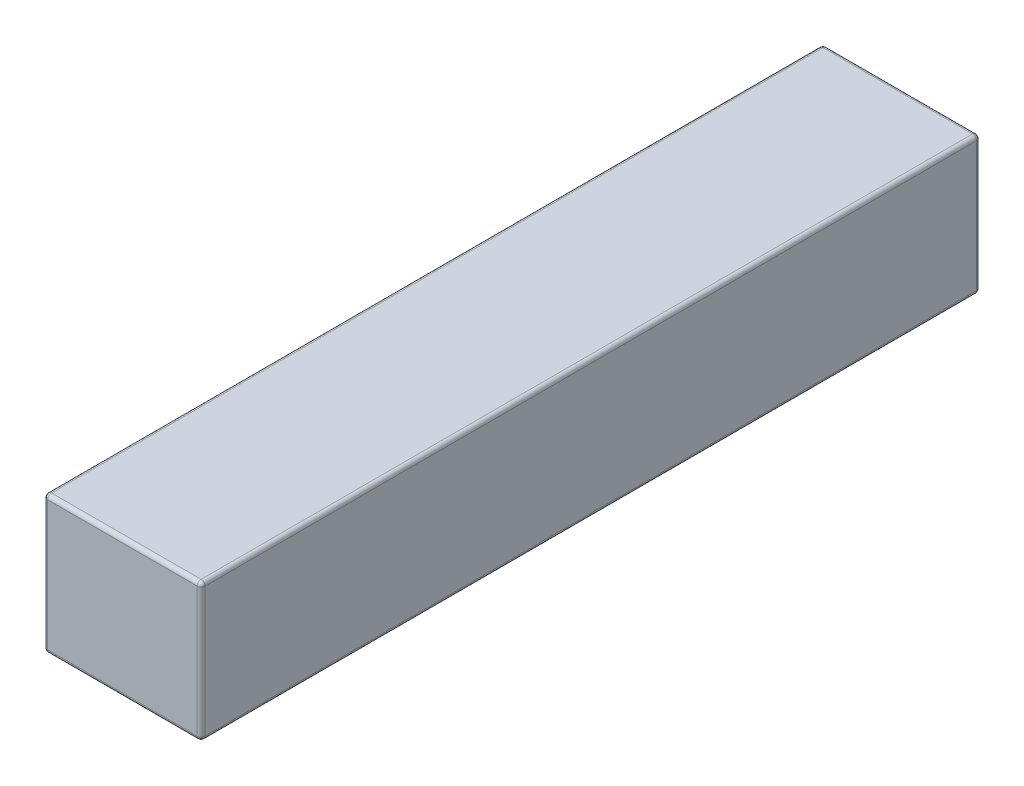
ISO-10303-21;
HEADER;
FILE_DESCRIPTION(('STEP AP214'),'2;1');
FILE_NAME('part.step','',(''),(''),'','','');
FILE_SCHEMA(('AUTOMOTIVE_DESIGN { 1 0 10303 214 1 1 1 1 }'));
ENDSEC;
DATA;
#1=APPLICATION_CONTEXT('core data for automotive mechanical design processes');
#2=APPLICATION_PROTOCOL_DEFINITION('international standard','automotive_design',2000,#1);
#3=PRODUCT_CONTEXT('',#1,'mechanical');
#4=PRODUCT('Part','Part','',(#3));
#5=PRODUCT_RELATED_PRODUCT_CATEGORY('part','',(#4));
#6=PRODUCT_DEFINITION_FORMATION('','',#4);
#7=PRODUCT_DEFINITION_CONTEXT('part definition',#1,'design');
#8=PRODUCT_DEFINITION('design','',#6,#7);
#9=PRODUCT_DEFINITION_SHAPE('','',#8);
#10=(LENGTH_UNIT() NAMED_UNIT(*) SI_UNIT(.MILLI.,.METRE.));
#11=(NAMED_UNIT(*) PLANE_ANGLE_UNIT() SI_UNIT($,.RADIAN.));
#12=(NAMED_UNIT(*) SI_UNIT($,.STERADIAN.) SOLID_ANGLE_UNIT());
#13=UNCERTAINTY_MEASURE_WITH_UNIT(LENGTH_MEASURE(1.E-05),#10,'distance_accuracy_value','');
#14=(GEOMETRIC_REPRESENTATION_CONTEXT(3) GLOBAL_UNCERTAINTY_ASSIGNED_CONTEXT((#13)) GLOBAL_UNIT_ASSIGNED_CONTEXT((#10,
#11,#12)) REPRESENTATION_CONTEXT('',''));
#15=CARTESIAN_POINT('',(0.,0.,0.));
#16=DIRECTION('',(0.,0.,1.));
#17=DIRECTION('',(1.,0.,0.));
#18=AXIS2_PLACEMENT_3D('',#15,#16,#17);
#19=CARTESIAN_POINT('',(-200.,-175.,1980.));
#20=DIRECTION('',(1.,0.,0.));
#21=DIRECTION('',(0.,0.,-1.));
#22=AXIS2_PLACEMENT_3D('',#19,#20,#21);
#23=PLANE('',#22);
#24=DIRECTION('',(0.,0.,-1.));
#25=VECTOR('',#24,1.);
#26=CARTESIAN_POINT('',(-200.,-165.,1980.));
#27=LINE('',#26,#25);
#28=CARTESIAN_POINT('',(-200.,-165.,10.));
#29=VERTEX_POINT('',#28);
#30=CARTESIAN_POINT('',(-200.,-165.,1970.));
#31=VERTEX_POINT('',#30);
#32=EDGE_CURVE('E128',#29,#31,#27,.F.);
#33=ORIENTED_EDGE('',*,*,#32,.T.);
#34=DIRECTION('',(0.,-1.,0.));
#35=VECTOR('',#34,1.);
#36=CARTESIAN_POINT('',(-200.,175.,1970.));
#37=LINE('',#36,#35);
#38=CARTESIAN_POINT('',(-200.,165.,1970.));
#39=VERTEX_POINT('',#38);
#40=EDGE_CURVE('E165',#31,#39,#37,.F.);
#41=ORIENTED_EDGE('',*,*,#40,.T.);
#42=DIRECTION('',(0.,0.,-1.));
#43=VECTOR('',#42,1.);
#44=CARTESIAN_POINT('',(-200.,165.,1980.));
#45=LINE('',#44,#43);
#46=CARTESIAN_POINT('',(-200.,165.,10.));
#47=VERTEX_POINT('',#46);
#48=EDGE_CURVE('E162',#39,#47,#45,.T.);
#49=ORIENTED_EDGE('',*,*,#48,.T.);
#50=DIRECTION('',(0.,-1.,0.));
#51=VECTOR('',#50,1.);
#52=CARTESIAN_POINT('',(-200.,-175.,10.));
#53=LINE('',#52,#51);
#54=EDGE_CURVE('E157',#47,#29,#53,.T.);
#55=ORIENTED_EDGE('',*,*,#54,.T.);
#56=EDGE_LOOP('',(#33,#41,#49,#55));
#57=FACE_BOUND('',#56,.T.);
#58=ADVANCED_FACE('F33',(#57),#23,.F.);
#59=CARTESIAN_POINT('',(200.,-175.,1980.));
#60=DIRECTION('',(0.,1.,0.));
#61=DIRECTION('',(-1.,0.,0.));
#62=AXIS2_PLACEMENT_3D('',#59,#60,#61);
#63=PLANE('',#62);
#64=DIRECTION('',(0.,0.,-1.));
#65=VECTOR('',#64,1.);
#66=CARTESIAN_POINT('',(190.,-175.,1980.));
#67=LINE('',#66,#65);
#68=CARTESIAN_POINT('',(190.,-175.,10.));
#69=VERTEX_POINT('',#68);
#70=CARTESIAN_POINT('',(190.,-175.,1970.));
#71=VERTEX_POINT('',#70);
#72=EDGE_CURVE('E150',#69,#71,#67,.F.);
#73=ORIENTED_EDGE('',*,*,#72,.T.);
#74=DIRECTION('',(1.,0.,0.));
#75=VECTOR('',#74,1.);
#76=CARTESIAN_POINT('',(-200.,-175.,1970.));
#77=LINE('',#76,#75);
#78=CARTESIAN_POINT('',(-190.,-175.,1970.));
#79=VERTEX_POINT('',#78);
#80=EDGE_CURVE('E154',#71,#79,#77,.F.);
#81=ORIENTED_EDGE('',*,*,#80,.T.);
#82=DIRECTION('',(0.,0.,-1.));
#83=VECTOR('',#82,1.);
#84=CARTESIAN_POINT('',(-190.,-175.,1980.));
#85=LINE('',#84,#83);
#86=CARTESIAN_POINT('',(-190.,-175.,10.));
#87=VERTEX_POINT('',#86);
#88=EDGE_CURVE('E126',#79,#87,#85,.T.);
#89=ORIENTED_EDGE('',*,*,#88,.T.);
#90=DIRECTION('',(1.,0.,0.));
#91=VECTOR('',#90,1.);
#92=CARTESIAN_POINT('',(200.,-175.,10.));
#93=LINE('',#92,#91);
#94=EDGE_CURVE('E144',#87,#69,#93,.T.);
#95=ORIENTED_EDGE('',*,*,#94,.T.);
#96=EDGE_LOOP('',(#73,#81,#89,#95));
#97=FACE_BOUND('',#96,.T.);
#98=ADVANCED_FACE('F152',(#97),#63,.F.);
#99=CARTESIAN_POINT('',(200.,-175.,1980.));
#100=DIRECTION('',(-1.,0.,0.));
#101=DIRECTION('',(0.,0.,1.));
#102=AXIS2_PLACEMENT_3D('',#99,#100,#101);
#103=PLANE('',#102);
#104=DIRECTION('',(0.,0.,-1.));
#105=VECTOR('',#104,1.);
#106=CARTESIAN_POINT('',(200.,165.,1980.));
#107=LINE('',#106,#105);
#108=CARTESIAN_POINT('',(200.,165.,10.));
#109=VERTEX_POINT('',#108);
#110=CARTESIAN_POINT('',(200.,165.,1970.));
#111=VERTEX_POINT('',#110);
#112=EDGE_CURVE('E169',#109,#111,#107,.F.);
#113=ORIENTED_EDGE('',*,*,#112,.T.);
#114=DIRECTION('',(0.,1.,0.));
#115=VECTOR('',#114,1.);
#116=CARTESIAN_POINT('',(200.,-175.,1970.));
#117=LINE('',#116,#115);
#118=CARTESIAN_POINT('',(200.,-165.,1970.));
#119=VERTEX_POINT('',#118);
#120=EDGE_CURVE('E174',#111,#119,#117,.F.);
#121=ORIENTED_EDGE('',*,*,#120,.T.);
#122=DIRECTION('',(0.,0.,-1.));
#123=VECTOR('',#122,1.);
#124=CARTESIAN_POINT('',(200.,-165.,1980.));
#125=LINE('',#124,#123);
#126=CARTESIAN_POINT('',(200.,-165.,10.));
#127=VERTEX_POINT('',#126);
#128=EDGE_CURVE('E171',#119,#127,#125,.T.);
#129=ORIENTED_EDGE('',*,*,#128,.T.);
#130=DIRECTION('',(0.,1.,0.));
#131=VECTOR('',#130,1.);
#132=CARTESIAN_POINT('',(200.,-175.,10.));
#133=LINE('',#132,#131);
#134=EDGE_CURVE('E167',#127,#109,#133,.T.);
#135=ORIENTED_EDGE('',*,*,#134,.T.);
#136=EDGE_LOOP('',(#113,#121,#129,#135));
#137=FACE_BOUND('',#136,.T.);
#138=ADVANCED_FACE('F279',(#137),#103,.F.);
#139=CARTESIAN_POINT('',(200.,175.,1980.));
#140=DIRECTION('',(0.,-1.,0.));
#141=DIRECTION('',(1.,0.,0.));
#142=AXIS2_PLACEMENT_3D('',#139,#140,#141);
#143=PLANE('',#142);
#144=DIRECTION('',(0.,0.,-1.));
#145=VECTOR('',#144,1.);
#146=CARTESIAN_POINT('',(-190.,175.,1980.));
#147=LINE('',#146,#145);
#148=CARTESIAN_POINT('',(-190.,175.,10.));
#149=VERTEX_POINT('',#148);
#150=CARTESIAN_POINT('',(-190.,175.,1970.));
#151=VERTEX_POINT('',#150);
#152=EDGE_CURVE('E178',#149,#151,#147,.F.);
#153=ORIENTED_EDGE('',*,*,#152,.T.);
#154=DIRECTION('',(-1.,0.,0.));
#155=VECTOR('',#154,1.);
#156=CARTESIAN_POINT('',(200.,175.,1970.));
#157=LINE('',#156,#155);
#158=CARTESIAN_POINT('',(190.,175.,1970.));
#159=VERTEX_POINT('',#158);
#160=EDGE_CURVE('E183',#151,#159,#157,.F.);
#161=ORIENTED_EDGE('',*,*,#160,.T.);
#162=DIRECTION('',(0.,0.,-1.));
#163=VECTOR('',#162,1.);
#164=CARTESIAN_POINT('',(190.,175.,1980.));
#165=LINE('',#164,#163);
#166=CARTESIAN_POINT('',(190.,175.,10.));
#167=VERTEX_POINT('',#166);
#168=EDGE_CURVE('E180',#159,#167,#165,.T.);
#169=ORIENTED_EDGE('',*,*,#168,.T.);
#170=DIRECTION('',(-1.,0.,0.));
#171=VECTOR('',#170,1.);
#172=CARTESIAN_POINT('',(200.,175.,10.));
#173=LINE('',#172,#171);
#174=EDGE_CURVE('E176',#167,#149,#173,.T.);
#175=ORIENTED_EDGE('',*,*,#174,.T.);
#176=EDGE_LOOP('',(#153,#161,#169,#175));
#177=FACE_BOUND('',#176,.T.);
#178=ADVANCED_FACE('F289',(#177),#143,.F.);
#179=CARTESIAN_POINT('',(0.,0.,1980.));
#180=DIRECTION('',(0.,0.,1.));
#181=DIRECTION('',(1.,0.,0.));
#182=AXIS2_PLACEMENT_3D('',#179,#180,#181);
#183=PLANE('',#182);
#184=DIRECTION('',(0.,1.,0.));
#185=VECTOR('',#184,1.);
#186=CARTESIAN_POINT('',(190.,175.,1980.));
#187=LINE('',#186,#185);
#188=CARTESIAN_POINT('',(190.,-165.,1980.));
#189=VERTEX_POINT('',#188);
#190=CARTESIAN_POINT('',(190.,165.,1980.));
#191=VERTEX_POINT('',#190);
#192=EDGE_CURVE('E189',#189,#191,#187,.T.);
#193=ORIENTED_EDGE('',*,*,#192,.T.);
#194=DIRECTION('',(-1.,0.,0.));
#195=VECTOR('',#194,1.);
#196=CARTESIAN_POINT('',(-200.,165.,1980.));
#197=LINE('',#196,#195);
#198=CARTESIAN_POINT('',(-190.,165.,1980.));
#199=VERTEX_POINT('',#198);
#200=EDGE_CURVE('E191',#191,#199,#197,.T.);
#201=ORIENTED_EDGE('',*,*,#200,.T.);
#202=DIRECTION('',(0.,-1.,0.));
#203=VECTOR('',#202,1.);
#204=CARTESIAN_POINT('',(-190.,-175.,1980.));
#205=LINE('',#204,#203);
#206=CARTESIAN_POINT('',(-190.,-165.,1980.));
#207=VERTEX_POINT('',#206);
#208=EDGE_CURVE('E185',#199,#207,#205,.T.);
#209=ORIENTED_EDGE('',*,*,#208,.T.);
#210=DIRECTION('',(1.,0.,0.));
#211=VECTOR('',#210,1.);
#212=CARTESIAN_POINT('',(200.,-165.,1980.));
#213=LINE('',#212,#211);
#214=EDGE_CURVE('E187',#207,#189,#213,.T.);
#215=ORIENTED_EDGE('',*,*,#214,.T.);
#216=EDGE_LOOP('',(#193,#201,#209,#215));
#217=FACE_BOUND('',#216,.T.);
#218=ADVANCED_FACE('F271',(#217),#183,.T.);
#219=CARTESIAN_POINT('',(0.,0.,0.));
#220=DIRECTION('',(0.,0.,1.));
#221=DIRECTION('',(1.,0.,0.));
#222=AXIS2_PLACEMENT_3D('',#219,#220,#221);
#223=PLANE('',#222);
#224=DIRECTION('',(0.,-1.,0.));
#225=VECTOR('',#224,1.);
#226=CARTESIAN_POINT('',(-190.,0.,0.));
#227=LINE('',#226,#225);
#228=CARTESIAN_POINT('',(-190.,-165.,0.));
#229=VERTEX_POINT('',#228);
#230=CARTESIAN_POINT('',(-190.,165.,0.));
#231=VERTEX_POINT('',#230);
#232=EDGE_CURVE('E194',#229,#231,#227,.F.);
#233=ORIENTED_EDGE('',*,*,#232,.T.);
#234=DIRECTION('',(-1.,0.,0.));
#235=VECTOR('',#234,1.);
#236=CARTESIAN_POINT('',(0.,165.,0.));
#237=LINE('',#236,#235);
#238=CARTESIAN_POINT('',(190.,165.,0.));
#239=VERTEX_POINT('',#238);
#240=EDGE_CURVE('E11',#231,#239,#237,.F.);
#241=ORIENTED_EDGE('',*,*,#240,.T.);
#242=DIRECTION('',(0.,1.,0.));
#243=VECTOR('',#242,1.);
#244=CARTESIAN_POINT('',(190.,0.,0.));
#245=LINE('',#244,#243);
#246=CARTESIAN_POINT('',(190.,-165.,0.));
#247=VERTEX_POINT('',#246);
#248=EDGE_CURVE('E42',#239,#247,#245,.F.);
#249=ORIENTED_EDGE('',*,*,#248,.T.);
#250=DIRECTION('',(1.,0.,0.));
#251=VECTOR('',#250,1.);
#252=CARTESIAN_POINT('',(0.,-165.,0.));
#253=LINE('',#252,#251);
#254=EDGE_CURVE('E196',#247,#229,#253,.F.);
#255=ORIENTED_EDGE('',*,*,#254,.T.);
#256=EDGE_LOOP('',(#233,#241,#249,#255));
#257=FACE_BOUND('',#256,.T.);
#258=ADVANCED_FACE('F478',(#257),#223,.F.);
#259=CARTESIAN_POINT('',(190.,165.,1980.));
#260=DIRECTION('',(0.,0.,-1.));
#261=DIRECTION('',(-1.,0.,0.));
#262=AXIS2_PLACEMENT_3D('',#259,#260,#261);
#263=CYLINDRICAL_SURFACE('',#262,10.);
#264=CARTESIAN_POINT('',(190.,165.,1970.));
#265=DIRECTION('',(0.,0.,1.));
#266=DIRECTION('',(1.,0.,0.));
#267=AXIS2_PLACEMENT_3D('',#264,#265,#266);
#268=CIRCLE('',#267,10.);
#269=EDGE_CURVE('E37',#111,#159,#268,.T.);
#270=ORIENTED_EDGE('',*,*,#269,.F.);
#271=ORIENTED_EDGE('',*,*,#112,.F.);
#272=CARTESIAN_POINT('',(190.,165.,10.));
#273=DIRECTION('',(0.,0.,-1.));
#274=DIRECTION('',(-1.,0.,0.));
#275=AXIS2_PLACEMENT_3D('',#272,#273,#274);
#276=CIRCLE('',#275,10.);
#277=EDGE_CURVE('E249',#167,#109,#276,.T.);
#278=ORIENTED_EDGE('',*,*,#277,.F.);
#279=ORIENTED_EDGE('',*,*,#168,.F.);
#280=EDGE_LOOP('',(#270,#271,#278,#279));
#281=FACE_BOUND('',#280,.T.);
#282=ADVANCED_FACE('F35',(#281),#263,.T.);
#283=CARTESIAN_POINT('',(190.,165.,1970.));
#284=DIRECTION('',(0.,0.,1.));
#285=DIRECTION('',(1.,0.,0.));
#286=AXIS2_PLACEMENT_3D('',#283,#284,#285);
#287=SPHERICAL_SURFACE('',#286,10.);
#288=CARTESIAN_POINT('',(190.,165.,1970.));
#289=DIRECTION('',(0.,1.,0.));
#290=DIRECTION('',(0.,0.,1.));
#291=AXIS2_PLACEMENT_3D('',#288,#289,#290);
#292=CIRCLE('',#291,10.);
#293=EDGE_CURVE('E244',#111,#191,#292,.F.);
#294=ORIENTED_EDGE('',*,*,#293,.F.);
#295=ORIENTED_EDGE('',*,*,#269,.T.);
#296=CARTESIAN_POINT('',(190.,165.,1970.));
#297=DIRECTION('',(1.,0.,0.));
#298=DIRECTION('',(0.,0.,-1.));
#299=AXIS2_PLACEMENT_3D('',#296,#297,#298);
#300=CIRCLE('',#299,10.);
#301=EDGE_CURVE('E247',#191,#159,#300,.F.);
#302=ORIENTED_EDGE('',*,*,#301,.F.);
#303=EDGE_LOOP('',(#294,#295,#302));
#304=FACE_BOUND('',#303,.T.);
#305=ADVANCED_FACE('F259',(#304),#287,.T.);
#306=CARTESIAN_POINT('',(190.,165.,10.));
#307=DIRECTION('',(0.,0.,1.));
#308=DIRECTION('',(1.,0.,0.));
#309=AXIS2_PLACEMENT_3D('',#306,#307,#308);
#310=SPHERICAL_SURFACE('',#309,10.);
#311=CARTESIAN_POINT('',(190.,165.,10.));
#312=DIRECTION('',(1.,0.,0.));
#313=DIRECTION('',(0.,0.,-1.));
#314=AXIS2_PLACEMENT_3D('',#311,#312,#313);
#315=CIRCLE('',#314,10.);
#316=EDGE_CURVE('E239',#167,#239,#315,.F.);
#317=ORIENTED_EDGE('',*,*,#316,.F.);
#318=ORIENTED_EDGE('',*,*,#277,.T.);
#319=CARTESIAN_POINT('',(190.,165.,10.));
#320=DIRECTION('',(0.,1.,0.));
#321=DIRECTION('',(0.,0.,1.));
#322=AXIS2_PLACEMENT_3D('',#319,#320,#321);
#323=CIRCLE('',#322,10.);
#324=EDGE_CURVE('E242',#239,#109,#323,.F.);
#325=ORIENTED_EDGE('',*,*,#324,.F.);
#326=EDGE_LOOP('',(#317,#318,#325));
#327=FACE_BOUND('',#326,.T.);
#328=ADVANCED_FACE('F457',(#327),#310,.T.);
#329=CARTESIAN_POINT('',(0.,165.,1970.));
#330=DIRECTION('',(1.,0.,0.));
#331=DIRECTION('',(0.,1.,0.));
#332=AXIS2_PLACEMENT_3D('',#329,#330,#331);
#333=CYLINDRICAL_SURFACE('',#332,10.);
#334=ORIENTED_EDGE('',*,*,#301,.T.);
#335=ORIENTED_EDGE('',*,*,#160,.F.);
#336=CARTESIAN_POINT('',(-190.,165.,1970.));
#337=DIRECTION('',(-1.,0.,0.));
#338=DIRECTION('',(0.,0.,1.));
#339=AXIS2_PLACEMENT_3D('',#336,#337,#338);
#340=CIRCLE('',#339,10.);
#341=EDGE_CURVE('E233',#199,#151,#340,.T.);
#342=ORIENTED_EDGE('',*,*,#341,.F.);
#343=ORIENTED_EDGE('',*,*,#200,.F.);
#344=EDGE_LOOP('',(#334,#335,#342,#343));
#345=FACE_BOUND('',#344,.T.);
#346=ADVANCED_FACE('F267',(#345),#333,.T.);
#347=CARTESIAN_POINT('',(190.,0.,1970.));
#348=DIRECTION('',(0.,-1.,0.));
#349=DIRECTION('',(0.,0.,-1.));
#350=AXIS2_PLACEMENT_3D('',#347,#348,#349);
#351=CYLINDRICAL_SURFACE('',#350,10.);
#352=ORIENTED_EDGE('',*,*,#293,.T.);
#353=ORIENTED_EDGE('',*,*,#192,.F.);
#354=CARTESIAN_POINT('',(190.,-165.,1970.));
#355=DIRECTION('',(0.,-1.,0.));
#356=DIRECTION('',(0.,0.,-1.));
#357=AXIS2_PLACEMENT_3D('',#354,#355,#356);
#358=CIRCLE('',#357,10.);
#359=EDGE_CURVE('E230',#119,#189,#358,.T.);
#360=ORIENTED_EDGE('',*,*,#359,.F.);
#361=ORIENTED_EDGE('',*,*,#120,.F.);
#362=EDGE_LOOP('',(#352,#353,#360,#361));
#363=FACE_BOUND('',#362,.T.);
#364=ADVANCED_FACE('F276',(#363),#351,.T.);
#365=CARTESIAN_POINT('',(190.,-165.,1980.));
#366=DIRECTION('',(0.,0.,-1.));
#367=DIRECTION('',(-1.,0.,0.));
#368=AXIS2_PLACEMENT_3D('',#365,#366,#367);
#369=CYLINDRICAL_SURFACE('',#368,10.);
#370=CARTESIAN_POINT('',(190.,-165.,10.));
#371=DIRECTION('',(0.,0.,-1.));
#372=DIRECTION('',(-1.,0.,0.));
#373=AXIS2_PLACEMENT_3D('',#370,#371,#372);
#374=CIRCLE('',#373,10.);
#375=EDGE_CURVE('E224',#127,#69,#374,.T.);
#376=ORIENTED_EDGE('',*,*,#375,.F.);
#377=ORIENTED_EDGE('',*,*,#128,.F.);
#378=CARTESIAN_POINT('',(190.,-165.,1970.));
#379=DIRECTION('',(0.,0.,1.));
#380=DIRECTION('',(1.,0.,0.));
#381=AXIS2_PLACEMENT_3D('',#378,#379,#380);
#382=CIRCLE('',#381,10.);
#383=EDGE_CURVE('E227',#71,#119,#382,.T.);
#384=ORIENTED_EDGE('',*,*,#383,.F.);
#385=ORIENTED_EDGE('',*,*,#72,.F.);
#386=EDGE_LOOP('',(#376,#377,#384,#385));
#387=FACE_BOUND('',#386,.T.);
#388=ADVANCED_FACE('F283',(#387),#369,.T.);
#389=CARTESIAN_POINT('',(190.,-175.,10.));
#390=DIRECTION('',(0.,1.,0.));
#391=DIRECTION('',(0.,0.,1.));
#392=AXIS2_PLACEMENT_3D('',#389,#390,#391);
#393=CYLINDRICAL_SURFACE('',#392,10.);
#394=ORIENTED_EDGE('',*,*,#324,.T.);
#395=ORIENTED_EDGE('',*,*,#134,.F.);
#396=CARTESIAN_POINT('',(190.,-165.,10.));
#397=DIRECTION('',(0.,-1.,0.));
#398=DIRECTION('',(0.,0.,-1.));
#399=AXIS2_PLACEMENT_3D('',#396,#397,#398);
#400=CIRCLE('',#399,10.);
#401=EDGE_CURVE('E222',#247,#127,#400,.T.);
#402=ORIENTED_EDGE('',*,*,#401,.F.);
#403=ORIENTED_EDGE('',*,*,#248,.F.);
#404=EDGE_LOOP('',(#394,#395,#402,#403));
#405=FACE_BOUND('',#404,.T.);
#406=ADVANCED_FACE('F287',(#405),#393,.T.);
#407=CARTESIAN_POINT('',(200.,165.,10.));
#408=DIRECTION('',(-1.,0.,0.));
#409=DIRECTION('',(0.,-1.,0.));
#410=AXIS2_PLACEMENT_3D('',#407,#408,#409);
#411=CYLINDRICAL_SURFACE('',#410,10.);
#412=ORIENTED_EDGE('',*,*,#316,.T.);
#413=ORIENTED_EDGE('',*,*,#240,.F.);
#414=CARTESIAN_POINT('',(-190.,165.,10.));
#415=DIRECTION('',(-1.,0.,0.));
#416=DIRECTION('',(0.,0.,1.));
#417=AXIS2_PLACEMENT_3D('',#414,#415,#416);
#418=CIRCLE('',#417,10.);
#419=EDGE_CURVE('E219',#149,#231,#418,.T.);
#420=ORIENTED_EDGE('',*,*,#419,.F.);
#421=ORIENTED_EDGE('',*,*,#174,.F.);
#422=EDGE_LOOP('',(#412,#413,#420,#421));
#423=FACE_BOUND('',#422,.T.);
#424=ADVANCED_FACE('F299',(#423),#411,.T.);
#425=CARTESIAN_POINT('',(-190.,165.,1980.));
#426=DIRECTION('',(0.,0.,-1.));
#427=DIRECTION('',(-1.,0.,0.));
#428=AXIS2_PLACEMENT_3D('',#425,#426,#427);
#429=CYLINDRICAL_SURFACE('',#428,10.);
#430=CARTESIAN_POINT('',(-190.,165.,1970.));
#431=DIRECTION('',(0.,0.,1.));
#432=DIRECTION('',(1.,0.,0.));
#433=AXIS2_PLACEMENT_3D('',#430,#431,#432);
#434=CIRCLE('',#433,10.);
#435=EDGE_CURVE('E236',#151,#39,#434,.T.);
#436=ORIENTED_EDGE('',*,*,#435,.F.);
#437=ORIENTED_EDGE('',*,*,#152,.F.);
#438=CARTESIAN_POINT('',(-190.,165.,10.));
#439=DIRECTION('',(0.,0.,-1.));
#440=DIRECTION('',(-1.,0.,0.));
#441=AXIS2_PLACEMENT_3D('',#438,#439,#440);
#442=CIRCLE('',#441,10.);
#443=EDGE_CURVE('E216',#47,#149,#442,.T.);
#444=ORIENTED_EDGE('',*,*,#443,.F.);
#445=ORIENTED_EDGE('',*,*,#48,.F.);
#446=EDGE_LOOP('',(#436,#437,#444,#445));
#447=FACE_BOUND('',#446,.T.);
#448=ADVANCED_FACE('F294',(#447),#429,.T.);
#449=CARTESIAN_POINT('',(-190.,165.,1970.));
#450=DIRECTION('',(0.,0.,1.));
#451=DIRECTION('',(1.,0.,0.));
#452=AXIS2_PLACEMENT_3D('',#449,#450,#451);
#453=SPHERICAL_SURFACE('',#452,10.);
#454=ORIENTED_EDGE('',*,*,#341,.T.);
#455=ORIENTED_EDGE('',*,*,#435,.T.);
#456=CARTESIAN_POINT('',(-190.,165.,1970.));
#457=DIRECTION('',(0.,1.,0.));
#458=DIRECTION('',(0.,0.,1.));
#459=AXIS2_PLACEMENT_3D('',#456,#457,#458);
#460=CIRCLE('',#459,10.);
#461=EDGE_CURVE('E213',#199,#39,#460,.F.);
#462=ORIENTED_EDGE('',*,*,#461,.F.);
#463=EDGE_LOOP('',(#454,#455,#462));
#464=FACE_BOUND('',#463,.T.);
#465=ADVANCED_FACE('F310',(#464),#453,.T.);
#466=CARTESIAN_POINT('',(190.,-165.,1970.));
#467=DIRECTION('',(0.,0.,1.));
#468=DIRECTION('',(1.,0.,0.));
#469=AXIS2_PLACEMENT_3D('',#466,#467,#468);
#470=SPHERICAL_SURFACE('',#469,10.);
#471=ORIENTED_EDGE('',*,*,#383,.T.);
#472=ORIENTED_EDGE('',*,*,#359,.T.);
#473=CARTESIAN_POINT('',(190.,-165.,1970.));
#474=DIRECTION('',(1.,0.,0.));
#475=DIRECTION('',(0.,0.,-1.));
#476=AXIS2_PLACEMENT_3D('',#473,#474,#475);
#477=CIRCLE('',#476,10.);
#478=EDGE_CURVE('E210',#71,#189,#477,.F.);
#479=ORIENTED_EDGE('',*,*,#478,.F.);
#480=EDGE_LOOP('',(#471,#472,#479));
#481=FACE_BOUND('',#480,.T.);
#482=ADVANCED_FACE('F320',(#481),#470,.T.);
#483=CARTESIAN_POINT('',(190.,-165.,10.));
#484=DIRECTION('',(0.,0.,1.));
#485=DIRECTION('',(1.,0.,0.));
#486=AXIS2_PLACEMENT_3D('',#483,#484,#485);
#487=SPHERICAL_SURFACE('',#486,10.);
#488=ORIENTED_EDGE('',*,*,#401,.T.);
#489=ORIENTED_EDGE('',*,*,#375,.T.);
#490=CARTESIAN_POINT('',(190.,-165.,10.));
#491=DIRECTION('',(1.,0.,0.));
#492=DIRECTION('',(0.,0.,-1.));
#493=AXIS2_PLACEMENT_3D('',#490,#491,#492);
#494=CIRCLE('',#493,10.);
#495=EDGE_CURVE('E147',#247,#69,#494,.F.);
#496=ORIENTED_EDGE('',*,*,#495,.F.);
#497=EDGE_LOOP('',(#488,#489,#496));
#498=FACE_BOUND('',#497,.T.);
#499=ADVANCED_FACE('F322',(#498),#487,.T.);
#500=CARTESIAN_POINT('',(-190.,165.,10.));
#501=DIRECTION('',(0.,0.,1.));
#502=DIRECTION('',(1.,0.,0.));
#503=AXIS2_PLACEMENT_3D('',#500,#501,#502);
#504=SPHERICAL_SURFACE('',#503,10.);
#505=ORIENTED_EDGE('',*,*,#443,.T.);
#506=ORIENTED_EDGE('',*,*,#419,.T.);
#507=CARTESIAN_POINT('',(-190.,165.,10.));
#508=DIRECTION('',(0.,1.,0.));
#509=DIRECTION('',(-1.,0.,0.));
#510=AXIS2_PLACEMENT_3D('',#507,#508,#509);
#511=CIRCLE('',#510,10.);
#512=EDGE_CURVE('E206',#47,#231,#511,.F.);
#513=ORIENTED_EDGE('',*,*,#512,.F.);
#514=EDGE_LOOP('',(#505,#506,#513));
#515=FACE_BOUND('',#514,.T.);
#516=ADVANCED_FACE('F301',(#515),#504,.T.);
#517=CARTESIAN_POINT('',(-190.,0.,1970.));
#518=DIRECTION('',(0.,1.,0.));
#519=DIRECTION('',(0.,0.,1.));
#520=AXIS2_PLACEMENT_3D('',#517,#518,#519);
#521=CYLINDRICAL_SURFACE('',#520,10.);
#522=ORIENTED_EDGE('',*,*,#461,.T.);
#523=ORIENTED_EDGE('',*,*,#40,.F.);
#524=CARTESIAN_POINT('',(-190.,-165.,1970.));
#525=DIRECTION('',(0.,-1.,0.));
#526=DIRECTION('',(0.,0.,-1.));
#527=AXIS2_PLACEMENT_3D('',#524,#525,#526);
#528=CIRCLE('',#527,10.);
#529=EDGE_CURVE('E203',#207,#31,#528,.T.);
#530=ORIENTED_EDGE('',*,*,#529,.F.);
#531=ORIENTED_EDGE('',*,*,#208,.F.);
#532=EDGE_LOOP('',(#522,#523,#530,#531));
#533=FACE_BOUND('',#532,.T.);
#534=ADVANCED_FACE('F312',(#533),#521,.T.);
#535=CARTESIAN_POINT('',(0.,-165.,1970.));
#536=DIRECTION('',(-1.,0.,0.));
#537=DIRECTION('',(0.,-1.,0.));
#538=AXIS2_PLACEMENT_3D('',#535,#536,#537);
#539=CYLINDRICAL_SURFACE('',#538,10.);
#540=ORIENTED_EDGE('',*,*,#478,.T.);
#541=ORIENTED_EDGE('',*,*,#214,.F.);
#542=CARTESIAN_POINT('',(-190.,-165.,1970.));
#543=DIRECTION('',(-1.,0.,0.));
#544=DIRECTION('',(0.,0.,1.));
#545=AXIS2_PLACEMENT_3D('',#542,#543,#544);
#546=CIRCLE('',#545,10.);
#547=EDGE_CURVE('E141',#79,#207,#546,.T.);
#548=ORIENTED_EDGE('',*,*,#547,.F.);
#549=ORIENTED_EDGE('',*,*,#80,.F.);
#550=EDGE_LOOP('',(#540,#541,#548,#549));
#551=FACE_BOUND('',#550,.T.);
#552=ADVANCED_FACE('F318',(#551),#539,.T.);
#553=CARTESIAN_POINT('',(200.,-165.,10.));
#554=DIRECTION('',(1.,0.,0.));
#555=DIRECTION('',(0.,1.,0.));
#556=AXIS2_PLACEMENT_3D('',#553,#554,#555);
#557=CYLINDRICAL_SURFACE('',#556,10.);
#558=ORIENTED_EDGE('',*,*,#495,.T.);
#559=ORIENTED_EDGE('',*,*,#94,.F.);
#560=CARTESIAN_POINT('',(-190.,-165.,10.));
#561=DIRECTION('',(-1.,0.,0.));
#562=DIRECTION('',(0.,0.,1.));
#563=AXIS2_PLACEMENT_3D('',#560,#561,#562);
#564=CIRCLE('',#563,10.);
#565=EDGE_CURVE('E134',#229,#87,#564,.T.);
#566=ORIENTED_EDGE('',*,*,#565,.F.);
#567=ORIENTED_EDGE('',*,*,#254,.F.);
#568=EDGE_LOOP('',(#558,#559,#566,#567));
#569=FACE_BOUND('',#568,.T.);
#570=ADVANCED_FACE('F145',(#569),#557,.T.);
#571=CARTESIAN_POINT('',(-190.,-175.,10.));
#572=DIRECTION('',(0.,-1.,0.));
#573=DIRECTION('',(0.,0.,-1.));
#574=AXIS2_PLACEMENT_3D('',#571,#572,#573);
#575=CYLINDRICAL_SURFACE('',#574,10.);
#576=ORIENTED_EDGE('',*,*,#512,.T.);
#577=ORIENTED_EDGE('',*,*,#232,.F.);
#578=CARTESIAN_POINT('',(-190.,-165.,10.));
#579=DIRECTION('',(0.,-1.,0.));
#580=DIRECTION('',(0.,0.,-1.));
#581=AXIS2_PLACEMENT_3D('',#578,#579,#580);
#582=CIRCLE('',#581,10.);
#583=EDGE_CURVE('E138',#29,#229,#582,.T.);
#584=ORIENTED_EDGE('',*,*,#583,.F.);
#585=ORIENTED_EDGE('',*,*,#54,.F.);
#586=EDGE_LOOP('',(#576,#577,#584,#585));
#587=FACE_BOUND('',#586,.T.);
#588=ADVANCED_FACE('F305',(#587),#575,.T.);
#589=CARTESIAN_POINT('',(-190.,-165.,1970.));
#590=DIRECTION('',(0.,0.,1.));
#591=DIRECTION('',(1.,0.,0.));
#592=AXIS2_PLACEMENT_3D('',#589,#590,#591);
#593=SPHERICAL_SURFACE('',#592,10.);
#594=ORIENTED_EDGE('',*,*,#547,.T.);
#595=ORIENTED_EDGE('',*,*,#529,.T.);
#596=CARTESIAN_POINT('',(-190.,-165.,1970.));
#597=DIRECTION('',(0.,0.,1.));
#598=DIRECTION('',(1.,0.,0.));
#599=AXIS2_PLACEMENT_3D('',#596,#597,#598);
#600=CIRCLE('',#599,10.);
#601=EDGE_CURVE('E131',#79,#31,#600,.F.);
#602=ORIENTED_EDGE('',*,*,#601,.F.);
#603=EDGE_LOOP('',(#594,#595,#602));
#604=FACE_BOUND('',#603,.T.);
#605=ADVANCED_FACE('F316',(#604),#593,.T.);
#606=CARTESIAN_POINT('',(-190.,-165.,10.));
#607=DIRECTION('',(0.,0.,1.));
#608=DIRECTION('',(1.,0.,0.));
#609=AXIS2_PLACEMENT_3D('',#606,#607,#608);
#610=SPHERICAL_SURFACE('',#609,10.);
#611=ORIENTED_EDGE('',*,*,#583,.T.);
#612=ORIENTED_EDGE('',*,*,#565,.T.);
#613=CARTESIAN_POINT('',(-190.,-165.,10.));
#614=DIRECTION('',(0.,0.,-1.));
#615=DIRECTION('',(-1.,0.,0.));
#616=AXIS2_PLACEMENT_3D('',#613,#614,#615);
#617=CIRCLE('',#616,10.);
#618=EDGE_CURVE('E122',#29,#87,#617,.F.);
#619=ORIENTED_EDGE('',*,*,#618,.F.);
#620=EDGE_LOOP('',(#611,#612,#619));
#621=FACE_BOUND('',#620,.T.);
#622=ADVANCED_FACE('F136',(#621),#610,.T.);
#623=CARTESIAN_POINT('',(-190.,-165.,1980.));
#624=DIRECTION('',(0.,0.,-1.));
#625=DIRECTION('',(-1.,0.,0.));
#626=AXIS2_PLACEMENT_3D('',#623,#624,#625);
#627=CYLINDRICAL_SURFACE('',#626,10.);
#628=ORIENTED_EDGE('',*,*,#601,.T.);
#629=ORIENTED_EDGE('',*,*,#32,.F.);
#630=ORIENTED_EDGE('',*,*,#618,.T.);
#631=ORIENTED_EDGE('',*,*,#88,.F.);
#632=EDGE_LOOP('',(#628,#629,#630,#631));
#633=FACE_BOUND('',#632,.T.);
#634=ADVANCED_FACE('F124',(#633),#627,.T.);
#635=CLOSED_SHELL('',(#58,#98,#138,#178,#218,#258,#282,#305,#328,#346,#364,#388,#406,#424,#448,
#465,#482,#499,#516,#534,#552,#570,#588,#605,#622,#634));
#636=MANIFOLD_SOLID_BREP('B2',#635);
#637=ADVANCED_BREP_SHAPE_REPRESENTATION('',(#18,#636),#14);
#638=SHAPE_DEFINITION_REPRESENTATION(#9,#637);
ENDSEC;
END-ISO-10303-21;
